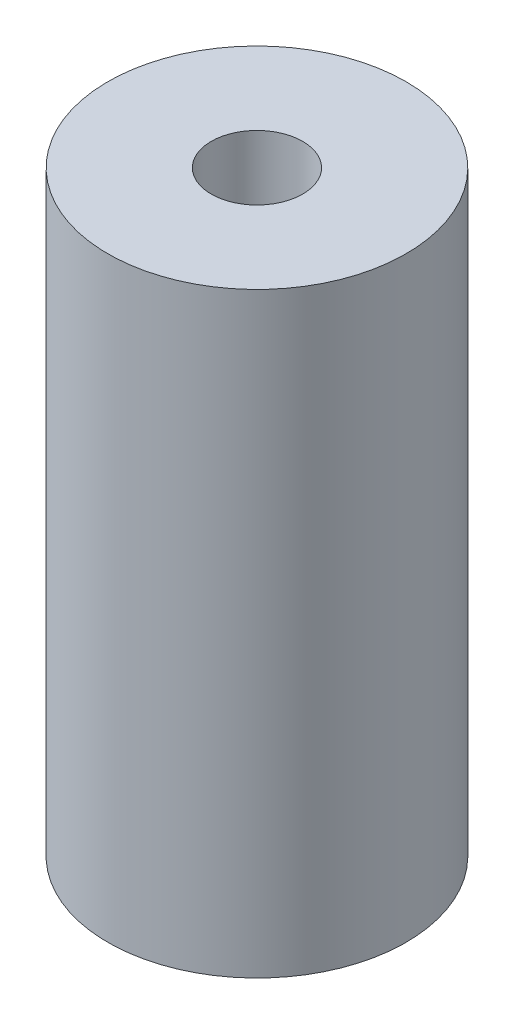
ISO-10303-21;
HEADER;
FILE_DESCRIPTION(('STEP AP214'),'2;1');
FILE_NAME('part.step','',(''),(''),'','','');
FILE_SCHEMA(('AUTOMOTIVE_DESIGN { 1 0 10303 214 1 1 1 1 }'));
ENDSEC;
DATA;
#1=APPLICATION_CONTEXT('core data for automotive mechanical design processes');
#2=APPLICATION_PROTOCOL_DEFINITION('international standard','automotive_design',2000,#1);
#3=PRODUCT_CONTEXT('',#1,'mechanical');
#4=PRODUCT('Part','Part','',(#3));
#5=PRODUCT_RELATED_PRODUCT_CATEGORY('part','',(#4));
#6=PRODUCT_DEFINITION_FORMATION('','',#4);
#7=PRODUCT_DEFINITION_CONTEXT('part definition',#1,'design');
#8=PRODUCT_DEFINITION('design','',#6,#7);
#9=PRODUCT_DEFINITION_SHAPE('','',#8);
#10=(LENGTH_UNIT() NAMED_UNIT(*) SI_UNIT(.MILLI.,.METRE.));
#11=(NAMED_UNIT(*) PLANE_ANGLE_UNIT() SI_UNIT($,.RADIAN.));
#12=(NAMED_UNIT(*) SI_UNIT($,.STERADIAN.) SOLID_ANGLE_UNIT());
#13=UNCERTAINTY_MEASURE_WITH_UNIT(LENGTH_MEASURE(1.E-05),#10,'distance_accuracy_value','');
#14=(GEOMETRIC_REPRESENTATION_CONTEXT(3) GLOBAL_UNCERTAINTY_ASSIGNED_CONTEXT((#13)) GLOBAL_UNIT_ASSIGNED_CONTEXT((#10,
#11,#12)) REPRESENTATION_CONTEXT('',''));
#15=CARTESIAN_POINT('',(0.,0.,0.));
#16=DIRECTION('',(0.,0.,1.));
#17=DIRECTION('',(1.,0.,0.));
#18=AXIS2_PLACEMENT_3D('',#15,#16,#17);
#19=CARTESIAN_POINT('',(0.,19.05,0.));
#20=DIRECTION('',(0.,1.,0.));
#21=DIRECTION('',(0.,0.,1.));
#22=AXIS2_PLACEMENT_3D('',#19,#20,#21);
#23=PLANE('',#22);
#24=CARTESIAN_POINT('',(0.,19.05,0.));
#25=DIRECTION('',(0.,1.,0.));
#26=DIRECTION('',(0.,0.,1.));
#27=AXIS2_PLACEMENT_3D('',#24,#25,#26);
#28=CIRCLE('',#27,4.7625);
#29=CARTESIAN_POINT('',(0.,19.05,-4.7625));
#30=VERTEX_POINT('',#29);
#31=EDGE_CURVE('E10',#30,#30,#28,.T.);
#32=ORIENTED_EDGE('',*,*,#31,.T.);
#33=EDGE_LOOP('',(#32));
#34=FACE_BOUND('',#33,.T.);
#35=CARTESIAN_POINT('',(0.,19.05,0.));
#36=DIRECTION('',(0.,1.,0.));
#37=DIRECTION('',(0.,0.,1.));
#38=AXIS2_PLACEMENT_3D('',#35,#36,#37);
#39=CIRCLE('',#38,1.4605);
#40=CARTESIAN_POINT('',(0.,19.05,-1.4605));
#41=VERTEX_POINT('',#40);
#42=EDGE_CURVE('E42',#41,#41,#39,.T.);
#43=ORIENTED_EDGE('',*,*,#42,.F.);
#44=EDGE_LOOP('',(#43));
#45=FACE_BOUND('',#44,.T.);
#46=ADVANCED_FACE('F31',(#34,#45),#23,.T.);
#47=CARTESIAN_POINT('',(0.,0.,0.));
#48=DIRECTION('',(0.,1.,0.));
#49=DIRECTION('',(0.,0.,1.));
#50=AXIS2_PLACEMENT_3D('',#47,#48,#49);
#51=PLANE('',#50);
#52=CARTESIAN_POINT('',(0.,0.,0.));
#53=DIRECTION('',(0.,1.,0.));
#54=DIRECTION('',(0.,0.,1.));
#55=AXIS2_PLACEMENT_3D('',#52,#53,#54);
#56=CIRCLE('',#55,4.7625);
#57=CARTESIAN_POINT('',(0.,0.,-4.7625));
#58=VERTEX_POINT('',#57);
#59=EDGE_CURVE('E35',#58,#58,#56,.T.);
#60=ORIENTED_EDGE('',*,*,#59,.F.);
#61=EDGE_LOOP('',(#60));
#62=FACE_BOUND('',#61,.T.);
#63=CARTESIAN_POINT('',(0.,0.,0.));
#64=DIRECTION('',(0.,1.,0.));
#65=DIRECTION('',(0.,0.,1.));
#66=AXIS2_PLACEMENT_3D('',#63,#64,#65);
#67=CIRCLE('',#66,1.4605);
#68=CARTESIAN_POINT('',(0.,0.,-1.4605));
#69=VERTEX_POINT('',#68);
#70=EDGE_CURVE('E44',#69,#69,#67,.T.);
#71=ORIENTED_EDGE('',*,*,#70,.T.);
#72=EDGE_LOOP('',(#71));
#73=FACE_BOUND('',#72,.T.);
#74=ADVANCED_FACE('F54',(#62,#73),#51,.F.);
#75=CARTESIAN_POINT('',(0.,19.05,0.));
#76=DIRECTION('',(0.,-1.,0.));
#77=DIRECTION('',(0.,0.,-1.));
#78=AXIS2_PLACEMENT_3D('',#75,#76,#77);
#79=CYLINDRICAL_SURFACE('',#78,4.7625);
#80=CARTESIAN_POINT('',(0.,19.05,-4.7625));
#81=CARTESIAN_POINT('',(0.,18.8515625,-4.7625));
#82=CARTESIAN_POINT('',(0.,18.653125,-4.7625));
#83=CARTESIAN_POINT('',(0.,18.25625,-4.7625));
#84=CARTESIAN_POINT('',(0.,18.0578125,-4.7625));
#85=CARTESIAN_POINT('',(0.,17.6609375,-4.7625));
#86=CARTESIAN_POINT('',(0.,17.4625,-4.7625));
#87=CARTESIAN_POINT('',(0.,17.065625,-4.7625));
#88=CARTESIAN_POINT('',(0.,16.8671875,-4.7625));
#89=CARTESIAN_POINT('',(0.,16.4703125,-4.7625));
#90=CARTESIAN_POINT('',(0.,16.271875,-4.7625));
#91=CARTESIAN_POINT('',(0.,15.875,-4.7625));
#92=CARTESIAN_POINT('',(0.,15.6765625,-4.7625));
#93=CARTESIAN_POINT('',(0.,15.2796875,-4.7625));
#94=CARTESIAN_POINT('',(0.,15.08125,-4.7625));
#95=CARTESIAN_POINT('',(0.,14.684375,-4.7625));
#96=CARTESIAN_POINT('',(0.,14.4859375,-4.7625));
#97=CARTESIAN_POINT('',(0.,14.0890625,-4.7625));
#98=CARTESIAN_POINT('',(0.,13.890625,-4.7625));
#99=CARTESIAN_POINT('',(0.,13.49375,-4.7625));
#100=CARTESIAN_POINT('',(0.,13.2953125,-4.7625));
#101=CARTESIAN_POINT('',(0.,12.8984375,-4.7625));
#102=CARTESIAN_POINT('',(0.,12.7,-4.7625));
#103=CARTESIAN_POINT('',(0.,12.303125,-4.7625));
#104=CARTESIAN_POINT('',(0.,12.1046875,-4.7625));
#105=CARTESIAN_POINT('',(0.,11.7078125,-4.7625));
#106=CARTESIAN_POINT('',(0.,11.509375,-4.7625));
#107=CARTESIAN_POINT('',(0.,11.1125,-4.7625));
#108=CARTESIAN_POINT('',(0.,10.9140625,-4.7625));
#109=CARTESIAN_POINT('',(0.,10.5171875,-4.7625));
#110=CARTESIAN_POINT('',(0.,10.31875,-4.7625));
#111=CARTESIAN_POINT('',(0.,9.921875,-4.7625));
#112=CARTESIAN_POINT('',(0.,9.7234375,-4.7625));
#113=CARTESIAN_POINT('',(0.,9.3265625,-4.7625));
#114=CARTESIAN_POINT('',(0.,9.128125,-4.7625));
#115=CARTESIAN_POINT('',(0.,8.73125,-4.7625));
#116=CARTESIAN_POINT('',(0.,8.5328125,-4.7625));
#117=CARTESIAN_POINT('',(0.,8.1359375,-4.7625));
#118=CARTESIAN_POINT('',(0.,7.9375,-4.7625));
#119=CARTESIAN_POINT('',(0.,7.540625,-4.7625));
#120=CARTESIAN_POINT('',(0.,7.3421875,-4.7625));
#121=CARTESIAN_POINT('',(0.,6.9453125,-4.7625));
#122=CARTESIAN_POINT('',(0.,6.746875,-4.7625));
#123=CARTESIAN_POINT('',(0.,6.35,-4.7625));
#124=CARTESIAN_POINT('',(0.,6.1515625,-4.7625));
#125=CARTESIAN_POINT('',(0.,5.7546875,-4.7625));
#126=CARTESIAN_POINT('',(0.,5.55625,-4.7625));
#127=CARTESIAN_POINT('',(0.,5.159375,-4.7625));
#128=CARTESIAN_POINT('',(0.,4.9609375,-4.7625));
#129=CARTESIAN_POINT('',(0.,4.5640625,-4.7625));
#130=CARTESIAN_POINT('',(0.,4.365625,-4.7625));
#131=CARTESIAN_POINT('',(0.,3.96875,-4.7625));
#132=CARTESIAN_POINT('',(0.,3.7703125,-4.7625));
#133=CARTESIAN_POINT('',(0.,3.3734375,-4.7625));
#134=CARTESIAN_POINT('',(0.,3.175,-4.7625));
#135=CARTESIAN_POINT('',(0.,2.778125,-4.7625));
#136=CARTESIAN_POINT('',(0.,2.5796875,-4.7625));
#137=CARTESIAN_POINT('',(0.,2.1828125,-4.7625));
#138=CARTESIAN_POINT('',(0.,1.984375,-4.7625));
#139=CARTESIAN_POINT('',(0.,1.5875,-4.7625));
#140=CARTESIAN_POINT('',(0.,1.3890625,-4.7625));
#141=CARTESIAN_POINT('',(0.,0.992187500000001,-4.7625));
#142=CARTESIAN_POINT('',(0.,0.793750000000001,-4.7625));
#143=CARTESIAN_POINT('',(0.,0.396875,-4.7625));
#144=CARTESIAN_POINT('',(0.,0.1984375,-4.7625));
#145=CARTESIAN_POINT('',(0.,0.,-4.7625));
#146=B_SPLINE_CURVE_WITH_KNOTS('',3,(#80,#81,#82,#83,#84,#85,#86,#87,#88,#89,#90,#91,#92,#93,
#94,#95,#96,#97,#98,#99,#100,#101,#102,#103,#104,#105,#106,#107,#108,#109,#110,#111,#112,#113,
#114,#115,#116,#117,#118,#119,#120,#121,#122,#123,#124,#125,#126,#127,#128,#129,#130,#131,#132,
#133,#134,#135,#136,#137,#138,#139,#140,#141,#142,#143,#144,#145),.UNSPECIFIED.,.F.,.F.,(4,2,2,
2,2,2,2,2,2,2,2,2,2,2,2,2,2,2,2,2,2,2,2,2,2,2,2,2,2,2,2,2,4),(0.,0.5953125,1.190625,1.7859375,
2.38125,2.9765625,3.571875,4.1671875,4.7625,5.3578125,5.953125,6.5484375,7.14375,7.7390625,
8.334375,8.9296875,9.525,10.1203125,10.715625,11.3109375,11.90625,12.5015625,13.096875,
13.6921875,14.2875,14.8828125,15.478125,16.0734375,16.66875,17.2640625,17.859375,18.4546875,
19.05),.UNSPECIFIED.);
#147=EDGE_CURVE('BSEAM33',#30,#58,#146,.T.);
#148=ORIENTED_EDGE('',*,*,#31,.F.);
#149=ORIENTED_EDGE('',*,*,#59,.T.);
#150=ORIENTED_EDGE('',*,*,#147,.T.);
#151=ORIENTED_EDGE('',*,*,#147,.F.);
#152=EDGE_LOOP('',(#148,#150,#149,#151));
#153=FACE_BOUND('',#152,.T.);
#154=ADVANCED_FACE('F33',(#153),#79,.T.);
#155=CARTESIAN_POINT('',(0.,19.05,0.));
#156=DIRECTION('',(0.,-1.,0.));
#157=DIRECTION('',(0.,0.,-1.));
#158=AXIS2_PLACEMENT_3D('',#155,#156,#157);
#159=CYLINDRICAL_SURFACE('',#158,1.4605);
#160=CARTESIAN_POINT('',(0.,19.05,-1.4605));
#161=CARTESIAN_POINT('',(0.,18.8515625,-1.4605));
#162=CARTESIAN_POINT('',(0.,18.653125,-1.4605));
#163=CARTESIAN_POINT('',(0.,18.25625,-1.4605));
#164=CARTESIAN_POINT('',(0.,18.0578125,-1.4605));
#165=CARTESIAN_POINT('',(0.,17.6609375,-1.4605));
#166=CARTESIAN_POINT('',(0.,17.4625,-1.4605));
#167=CARTESIAN_POINT('',(0.,17.065625,-1.4605));
#168=CARTESIAN_POINT('',(0.,16.8671875,-1.4605));
#169=CARTESIAN_POINT('',(0.,16.4703125,-1.4605));
#170=CARTESIAN_POINT('',(0.,16.271875,-1.4605));
#171=CARTESIAN_POINT('',(0.,15.875,-1.4605));
#172=CARTESIAN_POINT('',(0.,15.6765625,-1.4605));
#173=CARTESIAN_POINT('',(0.,15.2796875,-1.4605));
#174=CARTESIAN_POINT('',(0.,15.08125,-1.4605));
#175=CARTESIAN_POINT('',(0.,14.684375,-1.4605));
#176=CARTESIAN_POINT('',(0.,14.4859375,-1.4605));
#177=CARTESIAN_POINT('',(0.,14.0890625,-1.4605));
#178=CARTESIAN_POINT('',(0.,13.890625,-1.4605));
#179=CARTESIAN_POINT('',(0.,13.49375,-1.4605));
#180=CARTESIAN_POINT('',(0.,13.2953125,-1.4605));
#181=CARTESIAN_POINT('',(0.,12.8984375,-1.4605));
#182=CARTESIAN_POINT('',(0.,12.7,-1.4605));
#183=CARTESIAN_POINT('',(0.,12.303125,-1.4605));
#184=CARTESIAN_POINT('',(0.,12.1046875,-1.4605));
#185=CARTESIAN_POINT('',(0.,11.7078125,-1.4605));
#186=CARTESIAN_POINT('',(0.,11.509375,-1.4605));
#187=CARTESIAN_POINT('',(0.,11.1125,-1.4605));
#188=CARTESIAN_POINT('',(0.,10.9140625,-1.4605));
#189=CARTESIAN_POINT('',(0.,10.5171875,-1.4605));
#190=CARTESIAN_POINT('',(0.,10.31875,-1.4605));
#191=CARTESIAN_POINT('',(0.,9.921875,-1.4605));
#192=CARTESIAN_POINT('',(0.,9.7234375,-1.4605));
#193=CARTESIAN_POINT('',(0.,9.3265625,-1.4605));
#194=CARTESIAN_POINT('',(0.,9.128125,-1.4605));
#195=CARTESIAN_POINT('',(0.,8.73125,-1.4605));
#196=CARTESIAN_POINT('',(0.,8.5328125,-1.4605));
#197=CARTESIAN_POINT('',(0.,8.1359375,-1.4605));
#198=CARTESIAN_POINT('',(0.,7.9375,-1.4605));
#199=CARTESIAN_POINT('',(0.,7.540625,-1.4605));
#200=CARTESIAN_POINT('',(0.,7.3421875,-1.4605));
#201=CARTESIAN_POINT('',(0.,6.9453125,-1.4605));
#202=CARTESIAN_POINT('',(0.,6.746875,-1.4605));
#203=CARTESIAN_POINT('',(0.,6.35,-1.4605));
#204=CARTESIAN_POINT('',(0.,6.1515625,-1.4605));
#205=CARTESIAN_POINT('',(0.,5.7546875,-1.4605));
#206=CARTESIAN_POINT('',(0.,5.55625,-1.4605));
#207=CARTESIAN_POINT('',(0.,5.159375,-1.4605));
#208=CARTESIAN_POINT('',(0.,4.9609375,-1.4605));
#209=CARTESIAN_POINT('',(0.,4.5640625,-1.4605));
#210=CARTESIAN_POINT('',(0.,4.365625,-1.4605));
#211=CARTESIAN_POINT('',(0.,3.96875,-1.4605));
#212=CARTESIAN_POINT('',(0.,3.7703125,-1.4605));
#213=CARTESIAN_POINT('',(0.,3.3734375,-1.4605));
#214=CARTESIAN_POINT('',(0.,3.175,-1.4605));
#215=CARTESIAN_POINT('',(0.,2.778125,-1.4605));
#216=CARTESIAN_POINT('',(0.,2.5796875,-1.4605));
#217=CARTESIAN_POINT('',(0.,2.1828125,-1.4605));
#218=CARTESIAN_POINT('',(0.,1.984375,-1.4605));
#219=CARTESIAN_POINT('',(0.,1.5875,-1.4605));
#220=CARTESIAN_POINT('',(0.,1.3890625,-1.4605));
#221=CARTESIAN_POINT('',(0.,0.992187500000001,-1.4605));
#222=CARTESIAN_POINT('',(0.,0.793750000000001,-1.4605));
#223=CARTESIAN_POINT('',(0.,0.396875,-1.4605));
#224=CARTESIAN_POINT('',(0.,0.1984375,-1.4605));
#225=CARTESIAN_POINT('',(0.,0.,-1.4605));
#226=B_SPLINE_CURVE_WITH_KNOTS('',3,(#160,#161,#162,#163,#164,#165,#166,#167,#168,#169,#170,
#171,#172,#173,#174,#175,#176,#177,#178,#179,#180,#181,#182,#183,#184,#185,#186,#187,#188,#189,
#190,#191,#192,#193,#194,#195,#196,#197,#198,#199,#200,#201,#202,#203,#204,#205,#206,#207,#208,
#209,#210,#211,#212,#213,#214,#215,#216,#217,#218,#219,#220,#221,#222,#223,#224,#225),
.UNSPECIFIED.,.F.,.F.,(4,2,2,2,2,2,2,2,2,2,2,2,2,2,2,2,2,2,2,2,2,2,2,2,2,2,2,2,2,2,2,2,4),(0.,
0.5953125,1.190625,1.7859375,2.38125,2.9765625,3.571875,4.1671875,4.7625,5.3578125,5.953125,
6.5484375,7.14375,7.7390625,8.334375,8.9296875,9.525,10.1203125,10.715625,11.3109375,11.90625,
12.5015625,13.096875,13.6921875,14.2875,14.8828125,15.478125,16.0734375,16.66875,17.2640625,
17.859375,18.4546875,19.05),.UNSPECIFIED.);
#227=EDGE_CURVE('BSEAM50',#41,#69,#226,.T.);
#228=ORIENTED_EDGE('',*,*,#42,.T.);
#229=ORIENTED_EDGE('',*,*,#70,.F.);
#230=ORIENTED_EDGE('',*,*,#227,.T.);
#231=ORIENTED_EDGE('',*,*,#227,.F.);
#232=EDGE_LOOP('',(#228,#230,#229,#231));
#233=FACE_BOUND('',#232,.T.);
#234=ADVANCED_FACE('F50',(#233),#159,.F.);
#235=CLOSED_SHELL('',(#46,#74,#154,#234));
#236=MANIFOLD_SOLID_BREP('B2',#235);
#237=ADVANCED_BREP_SHAPE_REPRESENTATION('',(#18,#236),#14);
#238=SHAPE_DEFINITION_REPRESENTATION(#9,#237);
ENDSEC;
END-ISO-10303-21;
